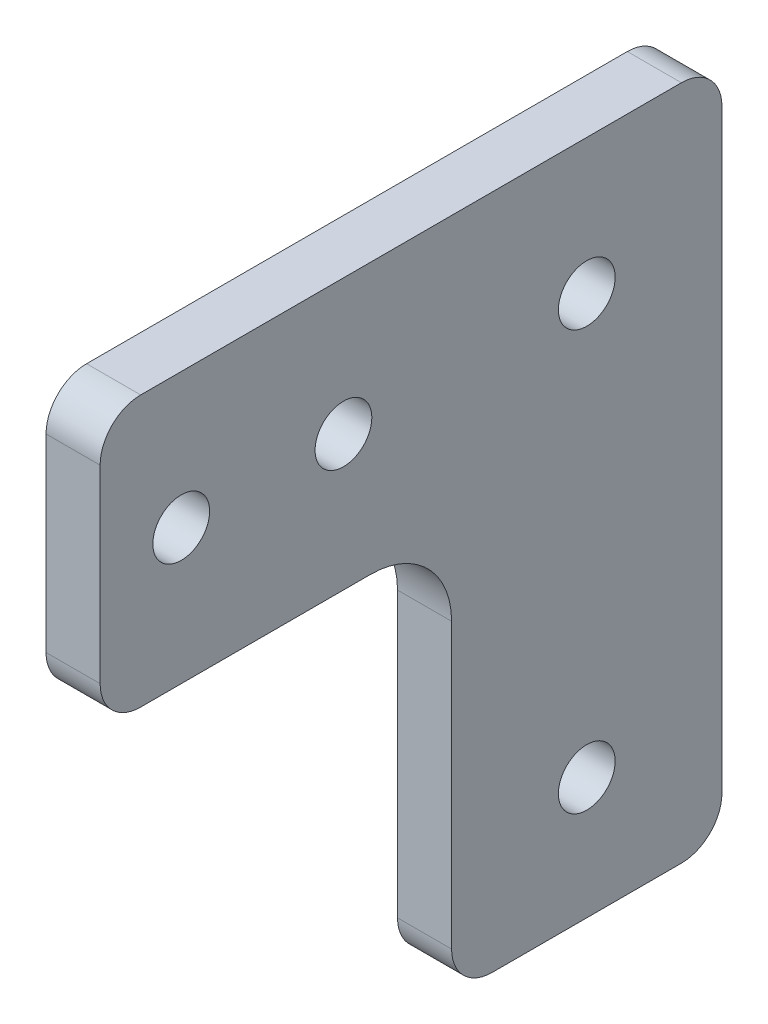
ISO-10303-21;
HEADER;
FILE_DESCRIPTION(('STEP AP214'),'2;1');
FILE_NAME('part.step','',(''),(''),'','','');
FILE_SCHEMA(('AUTOMOTIVE_DESIGN { 1 0 10303 214 1 1 1 1 }'));
ENDSEC;
DATA;
#1=APPLICATION_CONTEXT('core data for automotive mechanical design processes');
#2=APPLICATION_PROTOCOL_DEFINITION('international standard','automotive_design',2000,#1);
#3=PRODUCT_CONTEXT('',#1,'mechanical');
#4=PRODUCT('Part','Part','',(#3));
#5=PRODUCT_RELATED_PRODUCT_CATEGORY('part','',(#4));
#6=PRODUCT_DEFINITION_FORMATION('','',#4);
#7=PRODUCT_DEFINITION_CONTEXT('part definition',#1,'design');
#8=PRODUCT_DEFINITION('design','',#6,#7);
#9=PRODUCT_DEFINITION_SHAPE('','',#8);
#10=(LENGTH_UNIT() NAMED_UNIT(*) SI_UNIT(.MILLI.,.METRE.));
#11=(NAMED_UNIT(*) PLANE_ANGLE_UNIT() SI_UNIT($,.RADIAN.));
#12=(NAMED_UNIT(*) SI_UNIT($,.STERADIAN.) SOLID_ANGLE_UNIT());
#13=UNCERTAINTY_MEASURE_WITH_UNIT(LENGTH_MEASURE(1.E-05),#10,'distance_accuracy_value','');
#14=(GEOMETRIC_REPRESENTATION_CONTEXT(3) GLOBAL_UNCERTAINTY_ASSIGNED_CONTEXT((#13)) GLOBAL_UNIT_ASSIGNED_CONTEXT((#10,
#11,#12)) REPRESENTATION_CONTEXT('',''));
#15=CARTESIAN_POINT('',(0.,0.,0.));
#16=DIRECTION('',(0.,0.,1.));
#17=DIRECTION('',(1.,0.,0.));
#18=AXIS2_PLACEMENT_3D('',#15,#16,#17);
#19=CARTESIAN_POINT('',(4.,54.0416666666667,194.25));
#20=DIRECTION('',(-1.,0.,0.));
#21=DIRECTION('',(0.,0.,1.));
#22=AXIS2_PLACEMENT_3D('',#19,#20,#21);
#23=CYLINDRICAL_SURFACE('',#22,6.00000000000001);
#24=CARTESIAN_POINT('',(0.,54.0416666666667,194.25));
#25=DIRECTION('',(-1.,0.,0.));
#26=DIRECTION('',(0.,0.,-1.));
#27=AXIS2_PLACEMENT_3D('',#24,#25,#26);
#28=CIRCLE('',#27,6.00000000000001);
#29=CARTESIAN_POINT('',(0.,60.0416666666667,194.25));
#30=VERTEX_POINT('',#29);
#31=CARTESIAN_POINT('',(0.,54.0416666666667,188.25));
#32=VERTEX_POINT('',#31);
#33=EDGE_CURVE('E156',#30,#32,#28,.T.);
#34=ORIENTED_EDGE('',*,*,#33,.T.);
#35=DIRECTION('',(-1.,0.,0.));
#36=VECTOR('',#35,1.);
#37=CARTESIAN_POINT('',(4.,54.0416666666667,188.25));
#38=LINE('',#37,#36);
#39=CARTESIAN_POINT('',(4.,54.0416666666667,188.25));
#40=VERTEX_POINT('',#39);
#41=EDGE_CURVE('E11',#40,#32,#38,.T.);
#42=ORIENTED_EDGE('',*,*,#41,.F.);
#43=CARTESIAN_POINT('',(4.,54.0416666666667,194.25));
#44=DIRECTION('',(-1.,0.,0.));
#45=DIRECTION('',(0.,0.,-1.));
#46=AXIS2_PLACEMENT_3D('',#43,#44,#45);
#47=CIRCLE('',#46,6.00000000000001);
#48=CARTESIAN_POINT('',(4.,60.0416666666667,194.25));
#49=VERTEX_POINT('',#48);
#50=EDGE_CURVE('E178',#49,#40,#47,.T.);
#51=ORIENTED_EDGE('',*,*,#50,.F.);
#52=DIRECTION('',(-1.,0.,0.));
#53=VECTOR('',#52,1.);
#54=CARTESIAN_POINT('',(4.,60.0416666666667,194.25));
#55=LINE('',#54,#53);
#56=EDGE_CURVE('E152',#49,#30,#55,.T.);
#57=ORIENTED_EDGE('',*,*,#56,.T.);
#58=EDGE_LOOP('',(#34,#42,#51,#57));
#59=FACE_BOUND('',#58,.T.);
#60=ADVANCED_FACE('F34',(#59),#23,.F.);
#61=CARTESIAN_POINT('',(4.,33.0416666666667,188.25));
#62=DIRECTION('',(0.,0.,-1.));
#63=DIRECTION('',(0.,1.,0.));
#64=AXIS2_PLACEMENT_3D('',#61,#62,#63);
#65=PLANE('',#64);
#66=DIRECTION('',(0.,-1.,0.));
#67=VECTOR('',#66,1.);
#68=CARTESIAN_POINT('',(0.,33.0416666666667,188.25));
#69=LINE('',#68,#67);
#70=CARTESIAN_POINT('',(0.,33.0416666666667,188.25));
#71=VERTEX_POINT('',#70);
#72=EDGE_CURVE('E159',#32,#71,#69,.T.);
#73=ORIENTED_EDGE('',*,*,#72,.T.);
#74=DIRECTION('',(-1.,0.,0.));
#75=VECTOR('',#74,1.);
#76=CARTESIAN_POINT('',(4.,33.0416666666667,188.25));
#77=LINE('',#76,#75);
#78=CARTESIAN_POINT('',(4.,33.0416666666667,188.25));
#79=VERTEX_POINT('',#78);
#80=EDGE_CURVE('E43',#79,#71,#77,.T.);
#81=ORIENTED_EDGE('',*,*,#80,.F.);
#82=DIRECTION('',(0.,-1.,0.));
#83=VECTOR('',#82,1.);
#84=CARTESIAN_POINT('',(4.,33.0416666666667,188.25));
#85=LINE('',#84,#83);
#86=EDGE_CURVE('E107',#40,#79,#85,.T.);
#87=ORIENTED_EDGE('',*,*,#86,.F.);
#88=ORIENTED_EDGE('',*,*,#41,.T.);
#89=EDGE_LOOP('',(#73,#81,#87,#88));
#90=FACE_BOUND('',#89,.T.);
#91=ADVANCED_FACE('F230',(#90),#65,.F.);
#92=CARTESIAN_POINT('',(4.,33.0416666666667,185.25));
#93=DIRECTION('',(-1.,0.,0.));
#94=DIRECTION('',(0.,0.,1.));
#95=AXIS2_PLACEMENT_3D('',#92,#93,#94);
#96=CYLINDRICAL_SURFACE('',#95,3.);
#97=CARTESIAN_POINT('',(0.,33.0416666666667,185.25));
#98=DIRECTION('',(1.,0.,0.));
#99=DIRECTION('',(0.,0.,1.));
#100=AXIS2_PLACEMENT_3D('',#97,#98,#99);
#101=CIRCLE('',#100,3.);
#102=CARTESIAN_POINT('',(0.,30.0416666666667,185.25));
#103=VERTEX_POINT('',#102);
#104=EDGE_CURVE('E161',#71,#103,#101,.T.);
#105=ORIENTED_EDGE('',*,*,#104,.T.);
#106=DIRECTION('',(-1.,0.,0.));
#107=VECTOR('',#106,1.);
#108=CARTESIAN_POINT('',(4.,30.0416666666667,185.25));
#109=LINE('',#108,#107);
#110=CARTESIAN_POINT('',(4.,30.0416666666667,185.25));
#111=VERTEX_POINT('',#110);
#112=EDGE_CURVE('E197',#111,#103,#109,.T.);
#113=ORIENTED_EDGE('',*,*,#112,.F.);
#114=CARTESIAN_POINT('',(4.,33.0416666666667,185.25));
#115=DIRECTION('',(1.,0.,0.));
#116=DIRECTION('',(0.,0.,1.));
#117=AXIS2_PLACEMENT_3D('',#114,#115,#116);
#118=CIRCLE('',#117,3.);
#119=EDGE_CURVE('E245',#79,#111,#118,.T.);
#120=ORIENTED_EDGE('',*,*,#119,.F.);
#121=ORIENTED_EDGE('',*,*,#80,.T.);
#122=EDGE_LOOP('',(#105,#113,#120,#121));
#123=FACE_BOUND('',#122,.T.);
#124=ADVANCED_FACE('F235',(#123),#96,.T.);
#125=CARTESIAN_POINT('',(4.,30.0416666666667,171.25));
#126=DIRECTION('',(0.,1.,0.));
#127=DIRECTION('',(0.,0.,1.));
#128=AXIS2_PLACEMENT_3D('',#125,#126,#127);
#129=PLANE('',#128);
#130=DIRECTION('',(0.,0.,-1.));
#131=VECTOR('',#130,1.);
#132=CARTESIAN_POINT('',(0.,30.0416666666667,171.25));
#133=LINE('',#132,#131);
#134=CARTESIAN_POINT('',(0.,30.0416666666667,171.25));
#135=VERTEX_POINT('',#134);
#136=EDGE_CURVE('E163',#103,#135,#133,.T.);
#137=ORIENTED_EDGE('',*,*,#136,.T.);
#138=DIRECTION('',(-1.,0.,0.));
#139=VECTOR('',#138,1.);
#140=CARTESIAN_POINT('',(4.,30.0416666666667,171.25));
#141=LINE('',#140,#139);
#142=CARTESIAN_POINT('',(4.,30.0416666666667,171.25));
#143=VERTEX_POINT('',#142);
#144=EDGE_CURVE('E194',#143,#135,#141,.T.);
#145=ORIENTED_EDGE('',*,*,#144,.F.);
#146=DIRECTION('',(0.,0.,-1.));
#147=VECTOR('',#146,1.);
#148=CARTESIAN_POINT('',(4.,30.0416666666667,171.25));
#149=LINE('',#148,#147);
#150=EDGE_CURVE('E247',#111,#143,#149,.T.);
#151=ORIENTED_EDGE('',*,*,#150,.F.);
#152=ORIENTED_EDGE('',*,*,#112,.T.);
#153=EDGE_LOOP('',(#137,#145,#151,#152));
#154=FACE_BOUND('',#153,.T.);
#155=ADVANCED_FACE('F285',(#154),#129,.F.);
#156=CARTESIAN_POINT('',(4.,33.0416666666667,171.25));
#157=DIRECTION('',(-1.,0.,0.));
#158=DIRECTION('',(0.,0.,1.));
#159=AXIS2_PLACEMENT_3D('',#156,#157,#158);
#160=CYLINDRICAL_SURFACE('',#159,2.99999999999999);
#161=CARTESIAN_POINT('',(0.,33.0416666666667,171.25));
#162=DIRECTION('',(1.,0.,0.));
#163=DIRECTION('',(0.,0.,-1.));
#164=AXIS2_PLACEMENT_3D('',#161,#162,#163);
#165=CIRCLE('',#164,2.99999999999999);
#166=CARTESIAN_POINT('',(0.,33.0416666666667,168.25));
#167=VERTEX_POINT('',#166);
#168=EDGE_CURVE('E165',#135,#167,#165,.T.);
#169=ORIENTED_EDGE('',*,*,#168,.T.);
#170=DIRECTION('',(-1.,0.,0.));
#171=VECTOR('',#170,1.);
#172=CARTESIAN_POINT('',(4.,33.0416666666667,168.25));
#173=LINE('',#172,#171);
#174=CARTESIAN_POINT('',(4.,33.0416666666667,168.25));
#175=VERTEX_POINT('',#174);
#176=EDGE_CURVE('E191',#175,#167,#173,.T.);
#177=ORIENTED_EDGE('',*,*,#176,.F.);
#178=CARTESIAN_POINT('',(4.,33.0416666666667,171.25));
#179=DIRECTION('',(1.,0.,0.));
#180=DIRECTION('',(0.,0.,-1.));
#181=AXIS2_PLACEMENT_3D('',#178,#179,#180);
#182=CIRCLE('',#181,2.99999999999999);
#183=EDGE_CURVE('E249',#143,#175,#182,.T.);
#184=ORIENTED_EDGE('',*,*,#183,.F.);
#185=ORIENTED_EDGE('',*,*,#144,.T.);
#186=EDGE_LOOP('',(#169,#177,#184,#185));
#187=FACE_BOUND('',#186,.T.);
#188=ADVANCED_FACE('F282',(#187),#160,.T.);
#189=CARTESIAN_POINT('',(4.,77.0416666666667,168.25));
#190=DIRECTION('',(0.,0.,1.));
#191=DIRECTION('',(0.,-1.,0.));
#192=AXIS2_PLACEMENT_3D('',#189,#190,#191);
#193=PLANE('',#192);
#194=DIRECTION('',(0.,1.,0.));
#195=VECTOR('',#194,1.);
#196=CARTESIAN_POINT('',(0.,77.0416666666667,168.25));
#197=LINE('',#196,#195);
#198=CARTESIAN_POINT('',(0.,77.0416666666667,168.25));
#199=VERTEX_POINT('',#198);
#200=EDGE_CURVE('E167',#167,#199,#197,.T.);
#201=ORIENTED_EDGE('',*,*,#200,.T.);
#202=DIRECTION('',(-1.,0.,0.));
#203=VECTOR('',#202,1.);
#204=CARTESIAN_POINT('',(4.,77.0416666666667,168.25));
#205=LINE('',#204,#203);
#206=CARTESIAN_POINT('',(4.,77.0416666666667,168.25));
#207=VERTEX_POINT('',#206);
#208=EDGE_CURVE('E188',#207,#199,#205,.T.);
#209=ORIENTED_EDGE('',*,*,#208,.F.);
#210=DIRECTION('',(0.,1.,0.));
#211=VECTOR('',#210,1.);
#212=CARTESIAN_POINT('',(4.,77.0416666666667,168.25));
#213=LINE('',#212,#211);
#214=EDGE_CURVE('E255',#175,#207,#213,.T.);
#215=ORIENTED_EDGE('',*,*,#214,.F.);
#216=ORIENTED_EDGE('',*,*,#176,.T.);
#217=EDGE_LOOP('',(#201,#209,#215,#216));
#218=FACE_BOUND('',#217,.T.);
#219=ADVANCED_FACE('F278',(#218),#193,.F.);
#220=CARTESIAN_POINT('',(4.,77.0416666666667,171.25));
#221=DIRECTION('',(-1.,0.,0.));
#222=DIRECTION('',(0.,0.,1.));
#223=AXIS2_PLACEMENT_3D('',#220,#221,#222);
#224=CYLINDRICAL_SURFACE('',#223,3.);
#225=CARTESIAN_POINT('',(0.,77.0416666666667,171.25));
#226=DIRECTION('',(1.,0.,0.));
#227=DIRECTION('',(0.,0.,1.));
#228=AXIS2_PLACEMENT_3D('',#225,#226,#227);
#229=CIRCLE('',#228,3.);
#230=CARTESIAN_POINT('',(0.,80.0416666666667,171.25));
#231=VERTEX_POINT('',#230);
#232=EDGE_CURVE('E169',#199,#231,#229,.T.);
#233=ORIENTED_EDGE('',*,*,#232,.T.);
#234=DIRECTION('',(-1.,0.,0.));
#235=VECTOR('',#234,1.);
#236=CARTESIAN_POINT('',(4.,80.0416666666667,171.25));
#237=LINE('',#236,#235);
#238=CARTESIAN_POINT('',(4.,80.0416666666667,171.25));
#239=VERTEX_POINT('',#238);
#240=EDGE_CURVE('E185',#239,#231,#237,.T.);
#241=ORIENTED_EDGE('',*,*,#240,.F.);
#242=CARTESIAN_POINT('',(4.,77.0416666666667,171.25));
#243=DIRECTION('',(1.,0.,0.));
#244=DIRECTION('',(0.,0.,1.));
#245=AXIS2_PLACEMENT_3D('',#242,#243,#244);
#246=CIRCLE('',#245,3.);
#247=EDGE_CURVE('E257',#207,#239,#246,.T.);
#248=ORIENTED_EDGE('',*,*,#247,.F.);
#249=ORIENTED_EDGE('',*,*,#208,.T.);
#250=EDGE_LOOP('',(#233,#241,#248,#249));
#251=FACE_BOUND('',#250,.T.);
#252=ADVANCED_FACE('F274',(#251),#224,.T.);
#253=CARTESIAN_POINT('',(4.,80.0416666666667,211.25));
#254=DIRECTION('',(0.,-1.,0.));
#255=DIRECTION('',(0.,0.,-1.));
#256=AXIS2_PLACEMENT_3D('',#253,#254,#255);
#257=PLANE('',#256);
#258=DIRECTION('',(0.,0.,1.));
#259=VECTOR('',#258,1.);
#260=CARTESIAN_POINT('',(0.,80.0416666666667,211.25));
#261=LINE('',#260,#259);
#262=CARTESIAN_POINT('',(0.,80.0416666666667,211.25));
#263=VERTEX_POINT('',#262);
#264=EDGE_CURVE('E171',#231,#263,#261,.T.);
#265=ORIENTED_EDGE('',*,*,#264,.T.);
#266=DIRECTION('',(-1.,0.,0.));
#267=VECTOR('',#266,1.);
#268=CARTESIAN_POINT('',(4.,80.0416666666667,211.25));
#269=LINE('',#268,#267);
#270=CARTESIAN_POINT('',(4.,80.0416666666667,211.25));
#271=VERTEX_POINT('',#270);
#272=EDGE_CURVE('E182',#271,#263,#269,.T.);
#273=ORIENTED_EDGE('',*,*,#272,.F.);
#274=DIRECTION('',(0.,0.,1.));
#275=VECTOR('',#274,1.);
#276=CARTESIAN_POINT('',(4.,80.0416666666667,211.25));
#277=LINE('',#276,#275);
#278=EDGE_CURVE('E259',#239,#271,#277,.T.);
#279=ORIENTED_EDGE('',*,*,#278,.F.);
#280=ORIENTED_EDGE('',*,*,#240,.T.);
#281=EDGE_LOOP('',(#265,#273,#279,#280));
#282=FACE_BOUND('',#281,.T.);
#283=ADVANCED_FACE('F265',(#282),#257,.F.);
#284=CARTESIAN_POINT('',(4.,77.0416666666667,211.25));
#285=DIRECTION('',(-1.,0.,0.));
#286=DIRECTION('',(0.,0.,1.));
#287=AXIS2_PLACEMENT_3D('',#284,#285,#286);
#288=CYLINDRICAL_SURFACE('',#287,3.);
#289=CARTESIAN_POINT('',(0.,77.0416666666667,211.25));
#290=DIRECTION('',(1.,0.,0.));
#291=DIRECTION('',(0.,0.,1.));
#292=AXIS2_PLACEMENT_3D('',#289,#290,#291);
#293=CIRCLE('',#292,3.);
#294=CARTESIAN_POINT('',(0.,77.0416666666667,214.25));
#295=VERTEX_POINT('',#294);
#296=EDGE_CURVE('E173',#263,#295,#293,.T.);
#297=ORIENTED_EDGE('',*,*,#296,.T.);
#298=DIRECTION('',(-1.,0.,0.));
#299=VECTOR('',#298,1.);
#300=CARTESIAN_POINT('',(4.,77.0416666666667,214.25));
#301=LINE('',#300,#299);
#302=CARTESIAN_POINT('',(4.,77.0416666666667,214.25));
#303=VERTEX_POINT('',#302);
#304=EDGE_CURVE('E147',#303,#295,#301,.T.);
#305=ORIENTED_EDGE('',*,*,#304,.F.);
#306=CARTESIAN_POINT('',(4.,77.0416666666667,211.25));
#307=DIRECTION('',(1.,0.,0.));
#308=DIRECTION('',(0.,0.,1.));
#309=AXIS2_PLACEMENT_3D('',#306,#307,#308);
#310=CIRCLE('',#309,3.);
#311=EDGE_CURVE('E138',#271,#303,#310,.T.);
#312=ORIENTED_EDGE('',*,*,#311,.F.);
#313=ORIENTED_EDGE('',*,*,#272,.T.);
#314=EDGE_LOOP('',(#297,#305,#312,#313));
#315=FACE_BOUND('',#314,.T.);
#316=ADVANCED_FACE('F269',(#315),#288,.T.);
#317=CARTESIAN_POINT('',(4.,63.0416666666667,214.25));
#318=DIRECTION('',(0.,0.,-1.));
#319=DIRECTION('',(-1.,0.,0.));
#320=AXIS2_PLACEMENT_3D('',#317,#318,#319);
#321=PLANE('',#320);
#322=DIRECTION('',(0.,-1.,0.));
#323=VECTOR('',#322,1.);
#324=CARTESIAN_POINT('',(0.,63.0416666666667,214.25));
#325=LINE('',#324,#323);
#326=CARTESIAN_POINT('',(0.,63.0416666666667,214.25));
#327=VERTEX_POINT('',#326);
#328=EDGE_CURVE('E146',#295,#327,#325,.T.);
#329=ORIENTED_EDGE('',*,*,#328,.T.);
#330=DIRECTION('',(-1.,0.,0.));
#331=VECTOR('',#330,1.);
#332=CARTESIAN_POINT('',(4.,63.0416666666667,214.25));
#333=LINE('',#332,#331);
#334=CARTESIAN_POINT('',(4.,63.0416666666667,214.25));
#335=VERTEX_POINT('',#334);
#336=EDGE_CURVE('E143',#335,#327,#333,.T.);
#337=ORIENTED_EDGE('',*,*,#336,.F.);
#338=DIRECTION('',(0.,-1.,0.));
#339=VECTOR('',#338,1.);
#340=CARTESIAN_POINT('',(4.,63.0416666666667,214.25));
#341=LINE('',#340,#339);
#342=EDGE_CURVE('E132',#303,#335,#341,.T.);
#343=ORIENTED_EDGE('',*,*,#342,.F.);
#344=ORIENTED_EDGE('',*,*,#304,.T.);
#345=EDGE_LOOP('',(#329,#337,#343,#344));
#346=FACE_BOUND('',#345,.T.);
#347=ADVANCED_FACE('F144',(#346),#321,.F.);
#348=CARTESIAN_POINT('',(4.,63.0416666666667,211.25));
#349=DIRECTION('',(-1.,0.,0.));
#350=DIRECTION('',(0.,0.,1.));
#351=AXIS2_PLACEMENT_3D('',#348,#349,#350);
#352=CYLINDRICAL_SURFACE('',#351,3.);
#353=CARTESIAN_POINT('',(0.,63.0416666666667,211.25));
#354=DIRECTION('',(1.,0.,0.));
#355=DIRECTION('',(0.,0.,-1.));
#356=AXIS2_PLACEMENT_3D('',#353,#354,#355);
#357=CIRCLE('',#356,3.);
#358=CARTESIAN_POINT('',(0.,60.0416666666667,211.25));
#359=VERTEX_POINT('',#358);
#360=EDGE_CURVE('E93',#327,#359,#357,.T.);
#361=ORIENTED_EDGE('',*,*,#360,.T.);
#362=DIRECTION('',(-1.,0.,0.));
#363=VECTOR('',#362,1.);
#364=CARTESIAN_POINT('',(4.,60.0416666666667,211.25));
#365=LINE('',#364,#363);
#366=CARTESIAN_POINT('',(4.,60.0416666666667,211.25));
#367=VERTEX_POINT('',#366);
#368=EDGE_CURVE('E148',#367,#359,#365,.T.);
#369=ORIENTED_EDGE('',*,*,#368,.F.);
#370=CARTESIAN_POINT('',(4.,63.0416666666667,211.25));
#371=DIRECTION('',(1.,0.,0.));
#372=DIRECTION('',(0.,0.,-1.));
#373=AXIS2_PLACEMENT_3D('',#370,#371,#372);
#374=CIRCLE('',#373,3.);
#375=EDGE_CURVE('E136',#335,#367,#374,.T.);
#376=ORIENTED_EDGE('',*,*,#375,.F.);
#377=ORIENTED_EDGE('',*,*,#336,.T.);
#378=EDGE_LOOP('',(#361,#369,#376,#377));
#379=FACE_BOUND('',#378,.T.);
#380=ADVANCED_FACE('F150',(#379),#352,.T.);
#381=CARTESIAN_POINT('',(4.,60.0416666666667,194.25));
#382=DIRECTION('',(0.,1.,0.));
#383=DIRECTION('',(0.,0.,1.));
#384=AXIS2_PLACEMENT_3D('',#381,#382,#383);
#385=PLANE('',#384);
#386=DIRECTION('',(0.,0.,-1.));
#387=VECTOR('',#386,1.);
#388=CARTESIAN_POINT('',(0.,60.0416666666667,194.25));
#389=LINE('',#388,#387);
#390=EDGE_CURVE('E99',#359,#30,#389,.T.);
#391=ORIENTED_EDGE('',*,*,#390,.T.);
#392=ORIENTED_EDGE('',*,*,#56,.F.);
#393=DIRECTION('',(0.,0.,-1.));
#394=VECTOR('',#393,1.);
#395=CARTESIAN_POINT('',(4.,60.0416666666667,194.25));
#396=LINE('',#395,#394);
#397=EDGE_CURVE('E52',#367,#49,#396,.T.);
#398=ORIENTED_EDGE('',*,*,#397,.F.);
#399=ORIENTED_EDGE('',*,*,#368,.T.);
#400=EDGE_LOOP('',(#391,#392,#398,#399));
#401=FACE_BOUND('',#400,.T.);
#402=ADVANCED_FACE('F307',(#401),#385,.F.);
#403=CARTESIAN_POINT('',(4.,54.0416666666667,194.25));
#404=DIRECTION('',(1.,0.,0.));
#405=DIRECTION('',(0.,0.,-1.));
#406=AXIS2_PLACEMENT_3D('',#403,#404,#405);
#407=PLANE('',#406);
#408=CARTESIAN_POINT('',(4.,70.0416666666667,208.25));
#409=DIRECTION('',(1.,0.,0.));
#410=DIRECTION('',(0.,0.,-1.));
#411=AXIS2_PLACEMENT_3D('',#408,#409,#410);
#412=CIRCLE('',#411,2.09999999999999);
#413=CARTESIAN_POINT('',(4.,70.0416666666667,206.15));
#414=VERTEX_POINT('',#413);
#415=EDGE_CURVE('E206',#414,#414,#412,.T.);
#416=ORIENTED_EDGE('',*,*,#415,.F.);
#417=EDGE_LOOP('',(#416));
#418=FACE_BOUND('',#417,.T.);
#419=CARTESIAN_POINT('',(4.,70.0416666666667,178.25));
#420=DIRECTION('',(1.,0.,0.));
#421=DIRECTION('',(0.,0.,-1.));
#422=AXIS2_PLACEMENT_3D('',#419,#420,#421);
#423=CIRCLE('',#422,2.09999999999999);
#424=CARTESIAN_POINT('',(4.,70.0416666666667,176.15));
#425=VERTEX_POINT('',#424);
#426=EDGE_CURVE('E333',#425,#425,#423,.T.);
#427=ORIENTED_EDGE('',*,*,#426,.F.);
#428=EDGE_LOOP('',(#427));
#429=FACE_BOUND('',#428,.T.);
#430=CARTESIAN_POINT('',(4.,70.0416666666667,196.25));
#431=DIRECTION('',(1.,0.,0.));
#432=DIRECTION('',(0.,0.,-1.));
#433=AXIS2_PLACEMENT_3D('',#430,#431,#432);
#434=CIRCLE('',#433,2.09999999999999);
#435=CARTESIAN_POINT('',(4.,70.0416666666667,194.15));
#436=VERTEX_POINT('',#435);
#437=EDGE_CURVE('E326',#436,#436,#434,.T.);
#438=ORIENTED_EDGE('',*,*,#437,.F.);
#439=EDGE_LOOP('',(#438));
#440=FACE_BOUND('',#439,.T.);
#441=CARTESIAN_POINT('',(4.,39.0416666666667,178.25));
#442=DIRECTION('',(1.,0.,0.));
#443=DIRECTION('',(0.,0.,-1.));
#444=AXIS2_PLACEMENT_3D('',#441,#442,#443);
#445=CIRCLE('',#444,2.09999999999999);
#446=CARTESIAN_POINT('',(4.,39.0416666666667,176.15));
#447=VERTEX_POINT('',#446);
#448=EDGE_CURVE('E334',#447,#447,#445,.T.);
#449=ORIENTED_EDGE('',*,*,#448,.F.);
#450=EDGE_LOOP('',(#449));
#451=FACE_BOUND('',#450,.T.);
#452=ORIENTED_EDGE('',*,*,#50,.T.);
#453=ORIENTED_EDGE('',*,*,#86,.T.);
#454=ORIENTED_EDGE('',*,*,#119,.T.);
#455=ORIENTED_EDGE('',*,*,#150,.T.);
#456=ORIENTED_EDGE('',*,*,#183,.T.);
#457=ORIENTED_EDGE('',*,*,#214,.T.);
#458=ORIENTED_EDGE('',*,*,#247,.T.);
#459=ORIENTED_EDGE('',*,*,#278,.T.);
#460=ORIENTED_EDGE('',*,*,#311,.T.);
#461=ORIENTED_EDGE('',*,*,#342,.T.);
#462=ORIENTED_EDGE('',*,*,#375,.T.);
#463=ORIENTED_EDGE('',*,*,#397,.T.);
#464=EDGE_LOOP('',(#452,#453,#454,#455,#456,#457,#458,#459,#460,#461,#462,#463));
#465=FACE_BOUND('',#464,.T.);
#466=ADVANCED_FACE('F134',(#418,#429,#440,#451,#465),#407,.T.);
#467=CARTESIAN_POINT('',(0.,54.0416666666667,194.25));
#468=DIRECTION('',(1.,0.,0.));
#469=DIRECTION('',(0.,0.,-1.));
#470=AXIS2_PLACEMENT_3D('',#467,#468,#469);
#471=PLANE('',#470);
#472=CARTESIAN_POINT('',(0.,70.0416666666667,208.25));
#473=DIRECTION('',(1.,0.,0.));
#474=DIRECTION('',(0.,0.,-1.));
#475=AXIS2_PLACEMENT_3D('',#472,#473,#474);
#476=CIRCLE('',#475,2.09999999999999);
#477=CARTESIAN_POINT('',(0.,70.0416666666667,206.15));
#478=VERTEX_POINT('',#477);
#479=EDGE_CURVE('E37',#478,#478,#476,.T.);
#480=ORIENTED_EDGE('',*,*,#479,.T.);
#481=EDGE_LOOP('',(#480));
#482=FACE_BOUND('',#481,.T.);
#483=CARTESIAN_POINT('',(0.,70.0416666666667,178.25));
#484=DIRECTION('',(1.,0.,0.));
#485=DIRECTION('',(0.,0.,-1.));
#486=AXIS2_PLACEMENT_3D('',#483,#484,#485);
#487=CIRCLE('',#486,2.09999999999999);
#488=CARTESIAN_POINT('',(0.,70.0416666666667,176.15));
#489=VERTEX_POINT('',#488);
#490=EDGE_CURVE('E208',#489,#489,#487,.T.);
#491=ORIENTED_EDGE('',*,*,#490,.T.);
#492=EDGE_LOOP('',(#491));
#493=FACE_BOUND('',#492,.T.);
#494=CARTESIAN_POINT('',(0.,70.0416666666667,196.25));
#495=DIRECTION('',(1.,0.,0.));
#496=DIRECTION('',(0.,0.,-1.));
#497=AXIS2_PLACEMENT_3D('',#494,#495,#496);
#498=CIRCLE('',#497,2.09999999999999);
#499=CARTESIAN_POINT('',(0.,70.0416666666667,194.15));
#500=VERTEX_POINT('',#499);
#501=EDGE_CURVE('E205',#500,#500,#498,.T.);
#502=ORIENTED_EDGE('',*,*,#501,.T.);
#503=EDGE_LOOP('',(#502));
#504=FACE_BOUND('',#503,.T.);
#505=CARTESIAN_POINT('',(0.,39.0416666666667,178.25));
#506=DIRECTION('',(1.,0.,0.));
#507=DIRECTION('',(0.,0.,-1.));
#508=AXIS2_PLACEMENT_3D('',#505,#506,#507);
#509=CIRCLE('',#508,2.09999999999999);
#510=CARTESIAN_POINT('',(0.,39.0416666666667,176.15));
#511=VERTEX_POINT('',#510);
#512=EDGE_CURVE('E202',#511,#511,#509,.T.);
#513=ORIENTED_EDGE('',*,*,#512,.T.);
#514=EDGE_LOOP('',(#513));
#515=FACE_BOUND('',#514,.T.);
#516=ORIENTED_EDGE('',*,*,#33,.F.);
#517=ORIENTED_EDGE('',*,*,#390,.F.);
#518=ORIENTED_EDGE('',*,*,#360,.F.);
#519=ORIENTED_EDGE('',*,*,#328,.F.);
#520=ORIENTED_EDGE('',*,*,#296,.F.);
#521=ORIENTED_EDGE('',*,*,#264,.F.);
#522=ORIENTED_EDGE('',*,*,#232,.F.);
#523=ORIENTED_EDGE('',*,*,#200,.F.);
#524=ORIENTED_EDGE('',*,*,#168,.F.);
#525=ORIENTED_EDGE('',*,*,#136,.F.);
#526=ORIENTED_EDGE('',*,*,#104,.F.);
#527=ORIENTED_EDGE('',*,*,#72,.F.);
#528=EDGE_LOOP('',(#516,#517,#518,#519,#520,#521,#522,#523,#524,#525,#526,#527));
#529=FACE_BOUND('',#528,.T.);
#530=ADVANCED_FACE('F215',(#482,#493,#504,#515,#529),#471,.F.);
#531=CARTESIAN_POINT('',(-6.,39.0416666666667,178.25));
#532=DIRECTION('',(1.,0.,0.));
#533=DIRECTION('',(0.,0.,-1.));
#534=AXIS2_PLACEMENT_3D('',#531,#532,#533);
#535=CYLINDRICAL_SURFACE('',#534,2.09999999999999);
#536=ORIENTED_EDGE('',*,*,#448,.T.);
#537=EDGE_LOOP('',(#536));
#538=FACE_BOUND('',#537,.T.);
#539=ORIENTED_EDGE('',*,*,#512,.F.);
#540=EDGE_LOOP('',(#539));
#541=FACE_BOUND('',#540,.T.);
#542=ADVANCED_FACE('F312',(#538,#541),#535,.F.);
#543=CARTESIAN_POINT('',(-6.,70.0416666666667,196.25));
#544=DIRECTION('',(1.,0.,0.));
#545=DIRECTION('',(0.,0.,-1.));
#546=AXIS2_PLACEMENT_3D('',#543,#544,#545);
#547=CYLINDRICAL_SURFACE('',#546,2.09999999999999);
#548=ORIENTED_EDGE('',*,*,#437,.T.);
#549=EDGE_LOOP('',(#548));
#550=FACE_BOUND('',#549,.T.);
#551=ORIENTED_EDGE('',*,*,#501,.F.);
#552=EDGE_LOOP('',(#551));
#553=FACE_BOUND('',#552,.T.);
#554=ADVANCED_FACE('F225',(#550,#553),#547,.F.);
#555=CARTESIAN_POINT('',(-6.,70.0416666666667,178.25));
#556=DIRECTION('',(1.,0.,0.));
#557=DIRECTION('',(0.,0.,-1.));
#558=AXIS2_PLACEMENT_3D('',#555,#556,#557);
#559=CYLINDRICAL_SURFACE('',#558,2.09999999999999);
#560=ORIENTED_EDGE('',*,*,#426,.T.);
#561=EDGE_LOOP('',(#560));
#562=FACE_BOUND('',#561,.T.);
#563=ORIENTED_EDGE('',*,*,#490,.F.);
#564=EDGE_LOOP('',(#563));
#565=FACE_BOUND('',#564,.T.);
#566=ADVANCED_FACE('F219',(#562,#565),#559,.F.);
#567=CARTESIAN_POINT('',(-6.,70.0416666666667,208.25));
#568=DIRECTION('',(1.,0.,0.));
#569=DIRECTION('',(0.,0.,-1.));
#570=AXIS2_PLACEMENT_3D('',#567,#568,#569);
#571=CYLINDRICAL_SURFACE('',#570,2.09999999999999);
#572=ORIENTED_EDGE('',*,*,#415,.T.);
#573=EDGE_LOOP('',(#572));
#574=FACE_BOUND('',#573,.T.);
#575=ORIENTED_EDGE('',*,*,#479,.F.);
#576=EDGE_LOOP('',(#575));
#577=FACE_BOUND('',#576,.T.);
#578=ADVANCED_FACE('F217',(#574,#577),#571,.F.);
#579=CLOSED_SHELL('',(#60,#91,#124,#155,#188,#219,#252,#283,#316,#347,#380,#402,#466,#530,#542,
#554,#566,#578));
#580=MANIFOLD_SOLID_BREP('B2',#579);
#581=ADVANCED_BREP_SHAPE_REPRESENTATION('',(#18,#580),#14);
#582=SHAPE_DEFINITION_REPRESENTATION(#9,#581);
ENDSEC;
END-ISO-10303-21;
